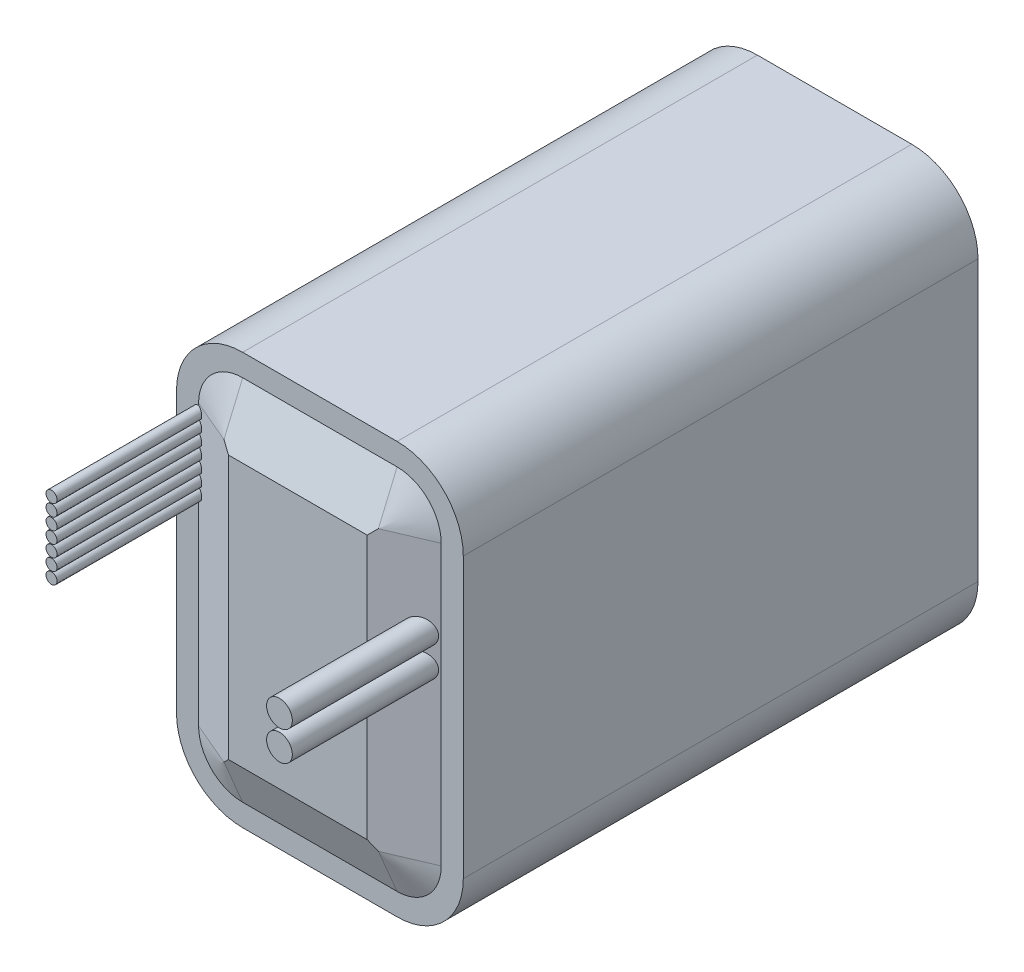
ISO-10303-21;
HEADER;
FILE_DESCRIPTION(('STEP AP214'),'2;1');
FILE_NAME('part.step','',(''),(''),'','','');
FILE_SCHEMA(('AUTOMOTIVE_DESIGN { 1 0 10303 214 1 1 1 1 }'));
ENDSEC;
DATA;
#1=APPLICATION_CONTEXT('core data for automotive mechanical design processes');
#2=APPLICATION_PROTOCOL_DEFINITION('international standard','automotive_design',2000,#1);
#3=PRODUCT_CONTEXT('',#1,'mechanical');
#4=PRODUCT('Part','Part','',(#3));
#5=PRODUCT_RELATED_PRODUCT_CATEGORY('part','',(#4));
#6=PRODUCT_DEFINITION_FORMATION('','',#4);
#7=PRODUCT_DEFINITION_CONTEXT('part definition',#1,'design');
#8=PRODUCT_DEFINITION('design','',#6,#7);
#9=PRODUCT_DEFINITION_SHAPE('','',#8);
#10=(LENGTH_UNIT() NAMED_UNIT(*) SI_UNIT(.MILLI.,.METRE.));
#11=(NAMED_UNIT(*) PLANE_ANGLE_UNIT() SI_UNIT($,.RADIAN.));
#12=(NAMED_UNIT(*) SI_UNIT($,.STERADIAN.) SOLID_ANGLE_UNIT());
#13=UNCERTAINTY_MEASURE_WITH_UNIT(LENGTH_MEASURE(1.E-05),#10,'distance_accuracy_value','');
#14=(GEOMETRIC_REPRESENTATION_CONTEXT(3) GLOBAL_UNCERTAINTY_ASSIGNED_CONTEXT((#13)) GLOBAL_UNIT_ASSIGNED_CONTEXT((#10,
#11,#12)) REPRESENTATION_CONTEXT('',''));
#15=CARTESIAN_POINT('',(0.,0.,0.));
#16=DIRECTION('',(0.,0.,1.));
#17=DIRECTION('',(1.,0.,0.));
#18=AXIS2_PLACEMENT_3D('',#15,#16,#17);
#19=CARTESIAN_POINT('',(10.5,19.,70.));
#20=DIRECTION('',(0.,0.,1.));
#21=DIRECTION('',(1.,0.,0.));
#22=AXIS2_PLACEMENT_3D('',#19,#20,#21);
#23=PLANE('',#22);
#24=CARTESIAN_POINT('',(10.5,19.,70.));
#25=DIRECTION('',(0.,0.,1.));
#26=DIRECTION('',(1.,0.,0.));
#27=AXIS2_PLACEMENT_3D('',#24,#25,#26);
#28=CIRCLE('',#27,9.);
#29=CARTESIAN_POINT('',(19.5,19.,70.));
#30=VERTEX_POINT('',#29);
#31=CARTESIAN_POINT('',(10.5,28.,70.));
#32=VERTEX_POINT('',#31);
#33=EDGE_CURVE('E301',#30,#32,#28,.T.);
#34=ORIENTED_EDGE('',*,*,#33,.T.);
#35=DIRECTION('',(-1.,0.,0.));
#36=VECTOR('',#35,1.);
#37=CARTESIAN_POINT('',(-10.5,28.,70.));
#38=LINE('',#37,#36);
#39=CARTESIAN_POINT('',(-10.5,28.,70.));
#40=VERTEX_POINT('',#39);
#41=EDGE_CURVE('E302',#32,#40,#38,.T.);
#42=ORIENTED_EDGE('',*,*,#41,.T.);
#43=CARTESIAN_POINT('',(-10.5,19.,70.));
#44=DIRECTION('',(0.,0.,1.));
#45=DIRECTION('',(-1.,0.,0.));
#46=AXIS2_PLACEMENT_3D('',#43,#44,#45);
#47=CIRCLE('',#46,9.);
#48=CARTESIAN_POINT('',(-19.5,19.,70.));
#49=VERTEX_POINT('',#48);
#50=EDGE_CURVE('E307',#40,#49,#47,.T.);
#51=ORIENTED_EDGE('',*,*,#50,.T.);
#52=DIRECTION('',(0.,-1.,0.));
#53=VECTOR('',#52,1.);
#54=CARTESIAN_POINT('',(-19.5,-19.,70.));
#55=LINE('',#54,#53);
#56=CARTESIAN_POINT('',(-19.5,-19.,70.));
#57=VERTEX_POINT('',#56);
#58=EDGE_CURVE('E310',#49,#57,#55,.T.);
#59=ORIENTED_EDGE('',*,*,#58,.T.);
#60=CARTESIAN_POINT('',(-10.5,-19.,70.));
#61=DIRECTION('',(0.,0.,1.));
#62=DIRECTION('',(1.,0.,0.));
#63=AXIS2_PLACEMENT_3D('',#60,#61,#62);
#64=CIRCLE('',#63,9.);
#65=CARTESIAN_POINT('',(-10.5,-28.,70.));
#66=VERTEX_POINT('',#65);
#67=EDGE_CURVE('E313',#57,#66,#64,.T.);
#68=ORIENTED_EDGE('',*,*,#67,.T.);
#69=DIRECTION('',(1.,0.,0.));
#70=VECTOR('',#69,1.);
#71=CARTESIAN_POINT('',(-10.5,-28.,70.));
#72=LINE('',#71,#70);
#73=CARTESIAN_POINT('',(10.5,-28.,70.));
#74=VERTEX_POINT('',#73);
#75=EDGE_CURVE('E311',#66,#74,#72,.T.);
#76=ORIENTED_EDGE('',*,*,#75,.T.);
#77=CARTESIAN_POINT('',(10.5,-19.,70.));
#78=DIRECTION('',(0.,0.,1.));
#79=DIRECTION('',(1.,0.,0.));
#80=AXIS2_PLACEMENT_3D('',#77,#78,#79);
#81=CIRCLE('',#80,9.);
#82=CARTESIAN_POINT('',(19.5,-19.,70.));
#83=VERTEX_POINT('',#82);
#84=EDGE_CURVE('E312',#74,#83,#81,.T.);
#85=ORIENTED_EDGE('',*,*,#84,.T.);
#86=DIRECTION('',(0.,1.,0.));
#87=VECTOR('',#86,1.);
#88=CARTESIAN_POINT('',(19.5,-19.,70.));
#89=LINE('',#88,#87);
#90=EDGE_CURVE('E320',#83,#30,#89,.T.);
#91=ORIENTED_EDGE('',*,*,#90,.T.);
#92=EDGE_LOOP('',(#34,#42,#51,#59,#68,#76,#85,#91));
#93=FACE_BOUND('',#92,.T.);
#94=CARTESIAN_POINT('',(-16.5,14.8,70.));
#95=DIRECTION('',(0.,0.,1.));
#96=DIRECTION('',(1.,0.,0.));
#97=AXIS2_PLACEMENT_3D('',#94,#95,#96);
#98=CIRCLE('',#97,0.750000000000002);
#99=CARTESIAN_POINT('',(-16.5,15.55,70.));
#100=VERTEX_POINT('',#99);
#101=CARTESIAN_POINT('',(-16.5,14.05,70.));
#102=VERTEX_POINT('',#101);
#103=EDGE_CURVE('E237',#100,#102,#98,.T.);
#104=ORIENTED_EDGE('',*,*,#103,.F.);
#105=DIRECTION('',(0.,-1.,0.));
#106=VECTOR('',#105,1.);
#107=CARTESIAN_POINT('',(-16.5,19.,70.));
#108=LINE('',#107,#106);
#109=CARTESIAN_POINT('',(-16.5,15.65,70.));
#110=VERTEX_POINT('',#109);
#111=EDGE_CURVE('E232',#110,#100,#108,.T.);
#112=ORIENTED_EDGE('',*,*,#111,.F.);
#113=CARTESIAN_POINT('',(-16.5,16.4,70.));
#114=DIRECTION('',(0.,0.,1.));
#115=DIRECTION('',(1.,0.,0.));
#116=AXIS2_PLACEMENT_3D('',#113,#114,#115);
#117=CIRCLE('',#116,0.750000000000002);
#118=CARTESIAN_POINT('',(-16.5,17.15,70.));
#119=VERTEX_POINT('',#118);
#120=EDGE_CURVE('E228',#119,#110,#117,.T.);
#121=ORIENTED_EDGE('',*,*,#120,.F.);
#122=CARTESIAN_POINT('',(-16.5,17.25,70.));
#123=VERTEX_POINT('',#122);
#124=EDGE_CURVE('E234',#123,#119,#108,.T.);
#125=ORIENTED_EDGE('',*,*,#124,.F.);
#126=CARTESIAN_POINT('',(-16.5,18.,70.));
#127=DIRECTION('',(0.,0.,1.));
#128=DIRECTION('',(1.,0.,0.));
#129=AXIS2_PLACEMENT_3D('',#126,#127,#128);
#130=CIRCLE('',#129,0.750000000000002);
#131=CARTESIAN_POINT('',(-16.5,18.75,70.));
#132=VERTEX_POINT('',#131);
#133=EDGE_CURVE('E754',#132,#123,#130,.T.);
#134=ORIENTED_EDGE('',*,*,#133,.F.);
#135=CARTESIAN_POINT('',(-16.5,19.,70.));
#136=VERTEX_POINT('',#135);
#137=EDGE_CURVE('E236',#136,#132,#108,.T.);
#138=ORIENTED_EDGE('',*,*,#137,.F.);
#139=CARTESIAN_POINT('',(-10.5,19.,70.));
#140=DIRECTION('',(0.,0.,1.));
#141=DIRECTION('',(1.,0.,0.));
#142=AXIS2_PLACEMENT_3D('',#139,#140,#141);
#143=CIRCLE('',#142,6.);
#144=CARTESIAN_POINT('',(-10.5,25.,70.));
#145=VERTEX_POINT('',#144);
#146=EDGE_CURVE('E242',#145,#136,#143,.T.);
#147=ORIENTED_EDGE('',*,*,#146,.F.);
#148=DIRECTION('',(-1.,0.,0.));
#149=VECTOR('',#148,1.);
#150=CARTESIAN_POINT('',(10.5,25.,70.));
#151=LINE('',#150,#149);
#152=CARTESIAN_POINT('',(10.5,25.,70.));
#153=VERTEX_POINT('',#152);
#154=EDGE_CURVE('E374',#153,#145,#151,.T.);
#155=ORIENTED_EDGE('',*,*,#154,.F.);
#156=CARTESIAN_POINT('',(10.5,19.,70.));
#157=DIRECTION('',(0.,0.,1.));
#158=DIRECTION('',(1.,0.,0.));
#159=AXIS2_PLACEMENT_3D('',#156,#157,#158);
#160=CIRCLE('',#159,6.);
#161=CARTESIAN_POINT('',(16.5,19.,70.));
#162=VERTEX_POINT('',#161);
#163=EDGE_CURVE('E373',#162,#153,#160,.T.);
#164=ORIENTED_EDGE('',*,*,#163,.F.);
#165=DIRECTION('',(0.,1.,0.));
#166=VECTOR('',#165,1.);
#167=CARTESIAN_POINT('',(16.5,-19.,70.));
#168=LINE('',#167,#166);
#169=CARTESIAN_POINT('',(16.5,-19.,70.));
#170=VERTEX_POINT('',#169);
#171=EDGE_CURVE('E251',#170,#162,#168,.T.);
#172=ORIENTED_EDGE('',*,*,#171,.F.);
#173=CARTESIAN_POINT('',(10.5,-19.,70.));
#174=DIRECTION('',(0.,0.,1.));
#175=DIRECTION('',(1.,0.,0.));
#176=AXIS2_PLACEMENT_3D('',#173,#174,#175);
#177=CIRCLE('',#176,6.);
#178=CARTESIAN_POINT('',(10.5,-25.,70.));
#179=VERTEX_POINT('',#178);
#180=EDGE_CURVE('E249',#179,#170,#177,.T.);
#181=ORIENTED_EDGE('',*,*,#180,.F.);
#182=DIRECTION('',(1.,0.,0.));
#183=VECTOR('',#182,1.);
#184=CARTESIAN_POINT('',(-10.5,-25.,70.));
#185=LINE('',#184,#183);
#186=CARTESIAN_POINT('',(-10.5,-25.,70.));
#187=VERTEX_POINT('',#186);
#188=EDGE_CURVE('E250',#187,#179,#185,.T.);
#189=ORIENTED_EDGE('',*,*,#188,.F.);
#190=CARTESIAN_POINT('',(-10.5,-19.,70.));
#191=DIRECTION('',(0.,0.,1.));
#192=DIRECTION('',(1.,0.,0.));
#193=AXIS2_PLACEMENT_3D('',#190,#191,#192);
#194=CIRCLE('',#193,6.);
#195=CARTESIAN_POINT('',(-16.5,-19.,70.));
#196=VERTEX_POINT('',#195);
#197=EDGE_CURVE('E245',#196,#187,#194,.T.);
#198=ORIENTED_EDGE('',*,*,#197,.F.);
#199=CARTESIAN_POINT('',(-16.5,7.65,70.));
#200=VERTEX_POINT('',#199);
#201=EDGE_CURVE('E197',#200,#196,#108,.T.);
#202=ORIENTED_EDGE('',*,*,#201,.F.);
#203=CARTESIAN_POINT('',(-16.5,8.4,70.));
#204=DIRECTION('',(0.,0.,1.));
#205=DIRECTION('',(1.,0.,0.));
#206=AXIS2_PLACEMENT_3D('',#203,#204,#205);
#207=CIRCLE('',#206,0.750000000000002);
#208=CARTESIAN_POINT('',(-16.5,9.15,70.));
#209=VERTEX_POINT('',#208);
#210=EDGE_CURVE('E199',#209,#200,#207,.T.);
#211=ORIENTED_EDGE('',*,*,#210,.F.);
#212=CARTESIAN_POINT('',(-16.5,9.25,70.));
#213=VERTEX_POINT('',#212);
#214=EDGE_CURVE('E189',#213,#209,#108,.T.);
#215=ORIENTED_EDGE('',*,*,#214,.F.);
#216=CARTESIAN_POINT('',(-16.5,10.,70.));
#217=DIRECTION('',(0.,0.,1.));
#218=DIRECTION('',(1.,0.,0.));
#219=AXIS2_PLACEMENT_3D('',#216,#217,#218);
#220=CIRCLE('',#219,0.750000000000002);
#221=CARTESIAN_POINT('',(-16.5,10.75,70.));
#222=VERTEX_POINT('',#221);
#223=EDGE_CURVE('E776',#222,#213,#220,.T.);
#224=ORIENTED_EDGE('',*,*,#223,.F.);
#225=CARTESIAN_POINT('',(-16.5,10.85,70.));
#226=VERTEX_POINT('',#225);
#227=EDGE_CURVE('E198',#226,#222,#108,.T.);
#228=ORIENTED_EDGE('',*,*,#227,.F.);
#229=CARTESIAN_POINT('',(-16.5,11.6,70.));
#230=DIRECTION('',(0.,0.,1.));
#231=DIRECTION('',(1.,0.,0.));
#232=AXIS2_PLACEMENT_3D('',#229,#230,#231);
#233=CIRCLE('',#232,0.750000000000002);
#234=CARTESIAN_POINT('',(-16.5,12.35,70.));
#235=VERTEX_POINT('',#234);
#236=EDGE_CURVE('E782',#235,#226,#233,.T.);
#237=ORIENTED_EDGE('',*,*,#236,.F.);
#238=CARTESIAN_POINT('',(-16.5,12.45,70.));
#239=VERTEX_POINT('',#238);
#240=EDGE_CURVE('E239',#239,#235,#108,.T.);
#241=ORIENTED_EDGE('',*,*,#240,.F.);
#242=CARTESIAN_POINT('',(-16.5,13.2,70.));
#243=DIRECTION('',(0.,0.,1.));
#244=DIRECTION('',(1.,0.,0.));
#245=AXIS2_PLACEMENT_3D('',#242,#243,#244);
#246=CIRCLE('',#245,0.750000000000002);
#247=CARTESIAN_POINT('',(-16.5,13.95,70.));
#248=VERTEX_POINT('',#247);
#249=EDGE_CURVE('E745',#248,#239,#246,.T.);
#250=ORIENTED_EDGE('',*,*,#249,.F.);
#251=EDGE_CURVE('E240',#102,#248,#108,.T.);
#252=ORIENTED_EDGE('',*,*,#251,.F.);
#253=EDGE_LOOP('',(#104,#112,#121,#125,#134,#138,#147,#155,#164,#172,#181,#189,#198,#202,#211,
#215,#224,#228,#237,#241,#250,#252));
#254=FACE_BOUND('',#253,.T.);
#255=ADVANCED_FACE('F39',(#93,#254),#23,.T.);
#256=CARTESIAN_POINT('',(10.5,19.,70.));
#257=DIRECTION('',(0.,0.,-1.));
#258=DIRECTION('',(-1.,0.,0.));
#259=AXIS2_PLACEMENT_3D('',#256,#257,#258);
#260=CYLINDRICAL_SURFACE('',#259,9.);
#261=CARTESIAN_POINT('',(10.5,19.,0.));
#262=DIRECTION('',(0.,0.,1.));
#263=DIRECTION('',(1.,0.,0.));
#264=AXIS2_PLACEMENT_3D('',#261,#262,#263);
#265=CIRCLE('',#264,9.);
#266=CARTESIAN_POINT('',(19.5,19.,0.));
#267=VERTEX_POINT('',#266);
#268=CARTESIAN_POINT('',(10.5,28.,0.));
#269=VERTEX_POINT('',#268);
#270=EDGE_CURVE('E268',#267,#269,#265,.T.);
#271=ORIENTED_EDGE('',*,*,#270,.T.);
#272=DIRECTION('',(0.,0.,-1.));
#273=VECTOR('',#272,1.);
#274=CARTESIAN_POINT('',(10.5,28.,70.));
#275=LINE('',#274,#273);
#276=EDGE_CURVE('E354',#32,#269,#275,.T.);
#277=ORIENTED_EDGE('',*,*,#276,.F.);
#278=ORIENTED_EDGE('',*,*,#33,.F.);
#279=DIRECTION('',(0.,0.,-1.));
#280=VECTOR('',#279,1.);
#281=CARTESIAN_POINT('',(19.5,19.,70.));
#282=LINE('',#281,#280);
#283=EDGE_CURVE('E317',#30,#267,#282,.T.);
#284=ORIENTED_EDGE('',*,*,#283,.T.);
#285=EDGE_LOOP('',(#271,#277,#278,#284));
#286=FACE_BOUND('',#285,.T.);
#287=ADVANCED_FACE('F41',(#286),#260,.T.);
#288=CARTESIAN_POINT('',(-10.5,28.,70.));
#289=DIRECTION('',(0.,-1.,0.));
#290=DIRECTION('',(1.,0.,0.));
#291=AXIS2_PLACEMENT_3D('',#288,#289,#290);
#292=PLANE('',#291);
#293=DIRECTION('',(-1.,0.,0.));
#294=VECTOR('',#293,1.);
#295=CARTESIAN_POINT('',(-10.5,28.,0.));
#296=LINE('',#295,#294);
#297=CARTESIAN_POINT('',(-10.5,28.,0.));
#298=VERTEX_POINT('',#297);
#299=EDGE_CURVE('E325',#269,#298,#296,.T.);
#300=ORIENTED_EDGE('',*,*,#299,.T.);
#301=DIRECTION('',(0.,0.,-1.));
#302=VECTOR('',#301,1.);
#303=CARTESIAN_POINT('',(-10.5,28.,70.));
#304=LINE('',#303,#302);
#305=EDGE_CURVE('E355',#40,#298,#304,.T.);
#306=ORIENTED_EDGE('',*,*,#305,.F.);
#307=ORIENTED_EDGE('',*,*,#41,.F.);
#308=ORIENTED_EDGE('',*,*,#276,.T.);
#309=EDGE_LOOP('',(#300,#306,#307,#308));
#310=FACE_BOUND('',#309,.T.);
#311=ADVANCED_FACE('F410',(#310),#292,.F.);
#312=CARTESIAN_POINT('',(-10.5,19.,70.));
#313=DIRECTION('',(0.,0.,-1.));
#314=DIRECTION('',(-1.,0.,0.));
#315=AXIS2_PLACEMENT_3D('',#312,#313,#314);
#316=CYLINDRICAL_SURFACE('',#315,9.);
#317=CARTESIAN_POINT('',(-10.5,19.,0.));
#318=DIRECTION('',(0.,0.,1.));
#319=DIRECTION('',(-1.,0.,0.));
#320=AXIS2_PLACEMENT_3D('',#317,#318,#319);
#321=CIRCLE('',#320,9.);
#322=CARTESIAN_POINT('',(-19.5,19.,0.));
#323=VERTEX_POINT('',#322);
#324=EDGE_CURVE('E322',#298,#323,#321,.T.);
#325=ORIENTED_EDGE('',*,*,#324,.T.);
#326=DIRECTION('',(0.,0.,-1.));
#327=VECTOR('',#326,1.);
#328=CARTESIAN_POINT('',(-19.5,19.,70.));
#329=LINE('',#328,#327);
#330=EDGE_CURVE('E349',#49,#323,#329,.T.);
#331=ORIENTED_EDGE('',*,*,#330,.F.);
#332=ORIENTED_EDGE('',*,*,#50,.F.);
#333=ORIENTED_EDGE('',*,*,#305,.T.);
#334=EDGE_LOOP('',(#325,#331,#332,#333));
#335=FACE_BOUND('',#334,.T.);
#336=ADVANCED_FACE('F434',(#335),#316,.T.);
#337=CARTESIAN_POINT('',(-19.5,-19.,70.));
#338=DIRECTION('',(1.,0.,0.));
#339=DIRECTION('',(0.,1.,0.));
#340=AXIS2_PLACEMENT_3D('',#337,#338,#339);
#341=PLANE('',#340);
#342=DIRECTION('',(0.,-1.,0.));
#343=VECTOR('',#342,1.);
#344=CARTESIAN_POINT('',(-19.5,-19.,0.));
#345=LINE('',#344,#343);
#346=CARTESIAN_POINT('',(-19.5,-19.,0.));
#347=VERTEX_POINT('',#346);
#348=EDGE_CURVE('E326',#323,#347,#345,.T.);
#349=ORIENTED_EDGE('',*,*,#348,.T.);
#350=DIRECTION('',(0.,0.,-1.));
#351=VECTOR('',#350,1.);
#352=CARTESIAN_POINT('',(-19.5,-19.,70.));
#353=LINE('',#352,#351);
#354=EDGE_CURVE('E347',#57,#347,#353,.T.);
#355=ORIENTED_EDGE('',*,*,#354,.F.);
#356=ORIENTED_EDGE('',*,*,#58,.F.);
#357=ORIENTED_EDGE('',*,*,#330,.T.);
#358=EDGE_LOOP('',(#349,#355,#356,#357));
#359=FACE_BOUND('',#358,.T.);
#360=ADVANCED_FACE('F431',(#359),#341,.F.);
#361=CARTESIAN_POINT('',(-10.5,-19.,70.));
#362=DIRECTION('',(0.,0.,-1.));
#363=DIRECTION('',(-1.,0.,0.));
#364=AXIS2_PLACEMENT_3D('',#361,#362,#363);
#365=CYLINDRICAL_SURFACE('',#364,9.);
#366=CARTESIAN_POINT('',(-10.5,-19.,0.));
#367=DIRECTION('',(0.,0.,1.));
#368=DIRECTION('',(1.,0.,0.));
#369=AXIS2_PLACEMENT_3D('',#366,#367,#368);
#370=CIRCLE('',#369,9.);
#371=CARTESIAN_POINT('',(-10.5,-28.,0.));
#372=VERTEX_POINT('',#371);
#373=EDGE_CURVE('E327',#347,#372,#370,.T.);
#374=ORIENTED_EDGE('',*,*,#373,.T.);
#375=DIRECTION('',(0.,0.,-1.));
#376=VECTOR('',#375,1.);
#377=CARTESIAN_POINT('',(-10.5,-28.,70.));
#378=LINE('',#377,#376);
#379=EDGE_CURVE('E344',#66,#372,#378,.T.);
#380=ORIENTED_EDGE('',*,*,#379,.F.);
#381=ORIENTED_EDGE('',*,*,#67,.F.);
#382=ORIENTED_EDGE('',*,*,#354,.T.);
#383=EDGE_LOOP('',(#374,#380,#381,#382));
#384=FACE_BOUND('',#383,.T.);
#385=ADVANCED_FACE('F430',(#384),#365,.T.);
#386=CARTESIAN_POINT('',(-10.5,-28.,70.));
#387=DIRECTION('',(0.,1.,0.));
#388=DIRECTION('',(-1.,0.,0.));
#389=AXIS2_PLACEMENT_3D('',#386,#387,#388);
#390=PLANE('',#389);
#391=DIRECTION('',(1.,0.,0.));
#392=VECTOR('',#391,1.);
#393=CARTESIAN_POINT('',(-10.5,-28.,0.));
#394=LINE('',#393,#392);
#395=CARTESIAN_POINT('',(10.5,-28.,0.));
#396=VERTEX_POINT('',#395);
#397=EDGE_CURVE('E329',#372,#396,#394,.T.);
#398=ORIENTED_EDGE('',*,*,#397,.T.);
#399=DIRECTION('',(0.,0.,-1.));
#400=VECTOR('',#399,1.);
#401=CARTESIAN_POINT('',(10.5,-28.,70.));
#402=LINE('',#401,#400);
#403=EDGE_CURVE('E339',#74,#396,#402,.T.);
#404=ORIENTED_EDGE('',*,*,#403,.F.);
#405=ORIENTED_EDGE('',*,*,#75,.F.);
#406=ORIENTED_EDGE('',*,*,#379,.T.);
#407=EDGE_LOOP('',(#398,#404,#405,#406));
#408=FACE_BOUND('',#407,.T.);
#409=ADVANCED_FACE('F421',(#408),#390,.F.);
#410=CARTESIAN_POINT('',(10.5,-19.,70.));
#411=DIRECTION('',(0.,0.,-1.));
#412=DIRECTION('',(-1.,0.,0.));
#413=AXIS2_PLACEMENT_3D('',#410,#411,#412);
#414=CYLINDRICAL_SURFACE('',#413,9.);
#415=CARTESIAN_POINT('',(10.5,-19.,0.));
#416=DIRECTION('',(0.,0.,1.));
#417=DIRECTION('',(1.,0.,0.));
#418=AXIS2_PLACEMENT_3D('',#415,#416,#417);
#419=CIRCLE('',#418,9.);
#420=CARTESIAN_POINT('',(19.5,-19.,0.));
#421=VERTEX_POINT('',#420);
#422=EDGE_CURVE('E335',#396,#421,#419,.T.);
#423=ORIENTED_EDGE('',*,*,#422,.T.);
#424=DIRECTION('',(0.,0.,-1.));
#425=VECTOR('',#424,1.);
#426=CARTESIAN_POINT('',(19.5,-19.,70.));
#427=LINE('',#426,#425);
#428=EDGE_CURVE('E340',#83,#421,#427,.T.);
#429=ORIENTED_EDGE('',*,*,#428,.F.);
#430=ORIENTED_EDGE('',*,*,#84,.F.);
#431=ORIENTED_EDGE('',*,*,#403,.T.);
#432=EDGE_LOOP('',(#423,#429,#430,#431));
#433=FACE_BOUND('',#432,.T.);
#434=ADVANCED_FACE('F420',(#433),#414,.T.);
#435=CARTESIAN_POINT('',(19.5,-19.,70.));
#436=DIRECTION('',(-1.,0.,0.));
#437=DIRECTION('',(0.,-1.,0.));
#438=AXIS2_PLACEMENT_3D('',#435,#436,#437);
#439=PLANE('',#438);
#440=DIRECTION('',(0.,1.,0.));
#441=VECTOR('',#440,1.);
#442=CARTESIAN_POINT('',(19.5,-19.,0.));
#443=LINE('',#442,#441);
#444=EDGE_CURVE('E304',#421,#267,#443,.T.);
#445=ORIENTED_EDGE('',*,*,#444,.T.);
#446=ORIENTED_EDGE('',*,*,#283,.F.);
#447=ORIENTED_EDGE('',*,*,#90,.F.);
#448=ORIENTED_EDGE('',*,*,#428,.T.);
#449=EDGE_LOOP('',(#445,#446,#447,#448));
#450=FACE_BOUND('',#449,.T.);
#451=ADVANCED_FACE('F414',(#450),#439,.F.);
#452=CARTESIAN_POINT('',(10.5,19.,0.));
#453=DIRECTION('',(0.,0.,1.));
#454=DIRECTION('',(1.,0.,0.));
#455=AXIS2_PLACEMENT_3D('',#452,#453,#454);
#456=PLANE('',#455);
#457=ORIENTED_EDGE('',*,*,#270,.F.);
#458=ORIENTED_EDGE('',*,*,#444,.F.);
#459=ORIENTED_EDGE('',*,*,#422,.F.);
#460=ORIENTED_EDGE('',*,*,#397,.F.);
#461=ORIENTED_EDGE('',*,*,#373,.F.);
#462=ORIENTED_EDGE('',*,*,#348,.F.);
#463=ORIENTED_EDGE('',*,*,#324,.F.);
#464=ORIENTED_EDGE('',*,*,#299,.F.);
#465=EDGE_LOOP('',(#457,#458,#459,#460,#461,#462,#463,#464));
#466=FACE_BOUND('',#465,.T.);
#467=ADVANCED_FACE('F415',(#466),#456,.F.);
#468=CARTESIAN_POINT('',(10.5,19.,70.));
#469=DIRECTION('',(0.,0.,-1.));
#470=DIRECTION('',(1.,0.,0.));
#471=AXIS2_PLACEMENT_3D('',#468,#469,#470);
#472=CONICAL_SURFACE('',#471,6.,1.1693705988362);
#473=DIRECTION('',(0.,0.920504853452441,-0.390731128489273));
#474=VECTOR('',#473,1.);
#475=CARTESIAN_POINT('',(10.5,25.,70.));
#476=LINE('',#475,#474);
#477=CARTESIAN_POINT('',(10.5,19.,72.5468488972576));
#478=VERTEX_POINT('',#477);
#479=EDGE_CURVE('E260',#478,#153,#476,.T.);
#480=ORIENTED_EDGE('',*,*,#479,.F.);
#481=DIRECTION('',(0.920504853452441,0.,-0.390731128489273));
#482=VECTOR('',#481,1.);
#483=CARTESIAN_POINT('',(16.5,19.,70.));
#484=LINE('',#483,#482);
#485=EDGE_CURVE('E265',#478,#162,#484,.T.);
#486=ORIENTED_EDGE('',*,*,#485,.T.);
#487=ORIENTED_EDGE('',*,*,#163,.T.);
#488=EDGE_LOOP('',(#480,#486,#487));
#489=FACE_BOUND('',#488,.T.);
#490=ADVANCED_FACE('F379',(#489),#472,.T.);
#491=CARTESIAN_POINT('',(10.5,25.,70.));
#492=DIRECTION('',(0.,0.390731128489273,0.920504853452441));
#493=DIRECTION('',(0.,-0.920504853452441,0.390731128489273));
#494=AXIS2_PLACEMENT_3D('',#491,#492,#493);
#495=PLANE('',#494);
#496=ORIENTED_EDGE('',*,*,#154,.T.);
#497=DIRECTION('',(0.,0.920504853452441,-0.390731128489273));
#498=VECTOR('',#497,1.);
#499=CARTESIAN_POINT('',(-10.5,25.,70.));
#500=LINE('',#499,#498);
#501=CARTESIAN_POINT('',(-10.5,19.,72.5468488972576));
#502=VERTEX_POINT('',#501);
#503=EDGE_CURVE('E261',#502,#145,#500,.T.);
#504=ORIENTED_EDGE('',*,*,#503,.F.);
#505=DIRECTION('',(-0.677257677459682,0.677257677459682,-0.287478828166241));
#506=VECTOR('',#505,1.);
#507=CARTESIAN_POINT('',(-13.7479322299315,22.2479322299315,71.1681834608962));
#508=LINE('',#507,#506);
#509=CARTESIAN_POINT('',(-9.43244290252871,17.9324429025287,73.));
#510=VERTEX_POINT('',#509);
#511=EDGE_CURVE('E284',#510,#502,#508,.T.);
#512=ORIENTED_EDGE('',*,*,#511,.F.);
#513=DIRECTION('',(1.,0.,0.));
#514=VECTOR('',#513,1.);
#515=CARTESIAN_POINT('',(10.5,17.9324429025287,73.));
#516=LINE('',#515,#514);
#517=CARTESIAN_POINT('',(9.43244290252872,17.9324429025287,73.));
#518=VERTEX_POINT('',#517);
#519=EDGE_CURVE('E258',#518,#510,#516,.F.);
#520=ORIENTED_EDGE('',*,*,#519,.F.);
#521=DIRECTION('',(0.677257677459682,0.677257677459682,-0.287478828166241));
#522=VECTOR('',#521,1.);
#523=CARTESIAN_POINT('',(13.7479322299315,22.2479322299315,71.1681834608962));
#524=LINE('',#523,#522);
#525=EDGE_CURVE('E257',#518,#478,#524,.T.);
#526=ORIENTED_EDGE('',*,*,#525,.T.);
#527=ORIENTED_EDGE('',*,*,#479,.T.);
#528=EDGE_LOOP('',(#496,#504,#512,#520,#526,#527));
#529=FACE_BOUND('',#528,.T.);
#530=ADVANCED_FACE('F385',(#529),#495,.T.);
#531=CARTESIAN_POINT('',(-10.5,19.,70.));
#532=DIRECTION('',(0.,0.,-1.));
#533=DIRECTION('',(1.,0.,0.));
#534=AXIS2_PLACEMENT_3D('',#531,#532,#533);
#535=CONICAL_SURFACE('',#534,6.,1.1693705988362);
#536=DIRECTION('',(-0.920504853452441,0.,-0.390731128489273));
#537=VECTOR('',#536,1.);
#538=CARTESIAN_POINT('',(-16.5,19.,70.));
#539=LINE('',#538,#537);
#540=EDGE_CURVE('E283',#502,#136,#539,.T.);
#541=ORIENTED_EDGE('',*,*,#540,.F.);
#542=ORIENTED_EDGE('',*,*,#503,.T.);
#543=ORIENTED_EDGE('',*,*,#146,.T.);
#544=EDGE_LOOP('',(#541,#542,#543));
#545=FACE_BOUND('',#544,.T.);
#546=ADVANCED_FACE('F516',(#545),#535,.T.);
#547=CARTESIAN_POINT('',(-16.5,19.,70.));
#548=DIRECTION('',(-0.390731128489273,0.,0.920504853452441));
#549=DIRECTION('',(0.920504853452441,0.,0.390731128489273));
#550=AXIS2_PLACEMENT_3D('',#547,#548,#549);
#551=PLANE('',#550);
#552=CARTESIAN_POINT('',(-16.5,14.8,70.));
#553=DIRECTION('',(-0.390731128489273,0.,0.920504853452441));
#554=DIRECTION('',(-0.920504853452441,0.,-0.390731128489273));
#555=AXIS2_PLACEMENT_3D('',#552,#553,#554);
#556=ELLIPSE('',#555,0.814770283053974,0.750000000000002);
#557=EDGE_CURVE('E11',#102,#100,#556,.T.);
#558=ORIENTED_EDGE('',*,*,#557,.F.);
#559=ORIENTED_EDGE('',*,*,#251,.T.);
#560=CARTESIAN_POINT('',(-16.5,13.2,70.));
#561=DIRECTION('',(-0.390731128489273,0.,0.920504853452441));
#562=DIRECTION('',(-0.920504853452441,0.,-0.390731128489273));
#563=AXIS2_PLACEMENT_3D('',#560,#561,#562);
#564=ELLIPSE('',#563,0.814770283053974,0.750000000000002);
#565=EDGE_CURVE('E218',#239,#248,#564,.T.);
#566=ORIENTED_EDGE('',*,*,#565,.F.);
#567=ORIENTED_EDGE('',*,*,#240,.T.);
#568=CARTESIAN_POINT('',(-16.5,11.6,70.));
#569=DIRECTION('',(-0.390731128489273,0.,0.920504853452441));
#570=DIRECTION('',(-0.920504853452441,0.,-0.390731128489273));
#571=AXIS2_PLACEMENT_3D('',#568,#569,#570);
#572=ELLIPSE('',#571,0.814770283053974,0.750000000000002);
#573=EDGE_CURVE('E209',#226,#235,#572,.T.);
#574=ORIENTED_EDGE('',*,*,#573,.F.);
#575=ORIENTED_EDGE('',*,*,#227,.T.);
#576=CARTESIAN_POINT('',(-16.5,10.,70.));
#577=DIRECTION('',(-0.390731128489273,0.,0.920504853452441));
#578=DIRECTION('',(-0.920504853452441,0.,-0.390731128489273));
#579=AXIS2_PLACEMENT_3D('',#576,#577,#578);
#580=ELLIPSE('',#579,0.814770283053974,0.750000000000002);
#581=EDGE_CURVE('E58',#213,#222,#580,.T.);
#582=ORIENTED_EDGE('',*,*,#581,.F.);
#583=ORIENTED_EDGE('',*,*,#214,.T.);
#584=CARTESIAN_POINT('',(-16.5,8.4,70.));
#585=DIRECTION('',(-0.390731128489273,0.,0.920504853452441));
#586=DIRECTION('',(-0.920504853452441,0.,-0.390731128489273));
#587=AXIS2_PLACEMENT_3D('',#584,#585,#586);
#588=ELLIPSE('',#587,0.814770283053974,0.750000000000002);
#589=EDGE_CURVE('E53',#200,#209,#588,.T.);
#590=ORIENTED_EDGE('',*,*,#589,.F.);
#591=ORIENTED_EDGE('',*,*,#201,.T.);
#592=DIRECTION('',(-0.920504853452441,0.,-0.390731128489273));
#593=VECTOR('',#592,1.);
#594=CARTESIAN_POINT('',(-16.5,-19.,70.));
#595=LINE('',#594,#593);
#596=CARTESIAN_POINT('',(-10.5,-19.,72.5468488972576));
#597=VERTEX_POINT('',#596);
#598=EDGE_CURVE('E276',#597,#196,#595,.T.);
#599=ORIENTED_EDGE('',*,*,#598,.F.);
#600=DIRECTION('',(-0.677257677459682,-0.677257677459682,-0.287478828166241));
#601=VECTOR('',#600,1.);
#602=CARTESIAN_POINT('',(-13.7479322299315,-22.2479322299315,71.1681834608962));
#603=LINE('',#602,#601);
#604=CARTESIAN_POINT('',(-9.43244290252871,-17.9324429025287,73.));
#605=VERTEX_POINT('',#604);
#606=EDGE_CURVE('E280',#605,#597,#603,.T.);
#607=ORIENTED_EDGE('',*,*,#606,.F.);
#608=DIRECTION('',(0.,1.,0.));
#609=VECTOR('',#608,1.);
#610=CARTESIAN_POINT('',(-9.43244290252871,19.,73.));
#611=LINE('',#610,#609);
#612=EDGE_CURVE('E296',#510,#605,#611,.F.);
#613=ORIENTED_EDGE('',*,*,#612,.F.);
#614=ORIENTED_EDGE('',*,*,#511,.T.);
#615=ORIENTED_EDGE('',*,*,#540,.T.);
#616=ORIENTED_EDGE('',*,*,#137,.T.);
#617=CARTESIAN_POINT('',(-16.5,18.,70.));
#618=DIRECTION('',(-0.390731128489273,0.,0.920504853452441));
#619=DIRECTION('',(-0.920504853452441,0.,-0.390731128489273));
#620=AXIS2_PLACEMENT_3D('',#617,#618,#619);
#621=ELLIPSE('',#620,0.814770283053974,0.750000000000002);
#622=EDGE_CURVE('E225',#123,#132,#621,.T.);
#623=ORIENTED_EDGE('',*,*,#622,.F.);
#624=ORIENTED_EDGE('',*,*,#124,.T.);
#625=CARTESIAN_POINT('',(-16.5,16.4,70.));
#626=DIRECTION('',(-0.390731128489273,0.,0.920504853452441));
#627=DIRECTION('',(-0.920504853452441,0.,-0.390731128489273));
#628=AXIS2_PLACEMENT_3D('',#625,#626,#627);
#629=ELLIPSE('',#628,0.814770283053974,0.750000000000002);
#630=EDGE_CURVE('E50',#110,#119,#629,.T.);
#631=ORIENTED_EDGE('',*,*,#630,.F.);
#632=ORIENTED_EDGE('',*,*,#111,.T.);
#633=EDGE_LOOP('',(#558,#559,#566,#567,#574,#575,#582,#583,#590,#591,#599,#607,#613,#614,#615,
#616,#623,#624,#631,#632));
#634=FACE_BOUND('',#633,.T.);
#635=ADVANCED_FACE('F195',(#634),#551,.T.);
#636=CARTESIAN_POINT('',(-10.5,-19.,70.));
#637=DIRECTION('',(0.,0.,-1.));
#638=DIRECTION('',(1.,0.,0.));
#639=AXIS2_PLACEMENT_3D('',#636,#637,#638);
#640=CONICAL_SURFACE('',#639,6.,1.1693705988362);
#641=DIRECTION('',(0.,-0.920504853452441,-0.390731128489273));
#642=VECTOR('',#641,1.);
#643=CARTESIAN_POINT('',(-10.5,-25.,70.));
#644=LINE('',#643,#642);
#645=EDGE_CURVE('E277',#597,#187,#644,.T.);
#646=ORIENTED_EDGE('',*,*,#645,.F.);
#647=ORIENTED_EDGE('',*,*,#598,.T.);
#648=ORIENTED_EDGE('',*,*,#197,.T.);
#649=EDGE_LOOP('',(#646,#647,#648));
#650=FACE_BOUND('',#649,.T.);
#651=ADVANCED_FACE('F399',(#650),#640,.T.);
#652=CARTESIAN_POINT('',(-10.5,-25.,70.));
#653=DIRECTION('',(0.,-0.390731128489273,0.920504853452441));
#654=DIRECTION('',(0.,0.920504853452441,0.390731128489273));
#655=AXIS2_PLACEMENT_3D('',#652,#653,#654);
#656=PLANE('',#655);
#657=ORIENTED_EDGE('',*,*,#188,.T.);
#658=DIRECTION('',(0.,-0.920504853452441,-0.390731128489273));
#659=VECTOR('',#658,1.);
#660=CARTESIAN_POINT('',(10.5,-25.,70.));
#661=LINE('',#660,#659);
#662=CARTESIAN_POINT('',(10.5,-19.,72.5468488972576));
#663=VERTEX_POINT('',#662);
#664=EDGE_CURVE('E271',#663,#179,#661,.T.);
#665=ORIENTED_EDGE('',*,*,#664,.F.);
#666=DIRECTION('',(0.677257677459682,-0.677257677459682,-0.287478828166241));
#667=VECTOR('',#666,1.);
#668=CARTESIAN_POINT('',(13.7479322299315,-22.2479322299315,71.1681834608962));
#669=LINE('',#668,#667);
#670=CARTESIAN_POINT('',(9.43244290252872,-17.9324429025287,73.));
#671=VERTEX_POINT('',#670);
#672=EDGE_CURVE('E267',#671,#663,#669,.T.);
#673=ORIENTED_EDGE('',*,*,#672,.F.);
#674=DIRECTION('',(-1.,0.,0.));
#675=VECTOR('',#674,1.);
#676=CARTESIAN_POINT('',(-10.5,-17.9324429025287,73.));
#677=LINE('',#676,#675);
#678=EDGE_CURVE('E291',#605,#671,#677,.F.);
#679=ORIENTED_EDGE('',*,*,#678,.F.);
#680=ORIENTED_EDGE('',*,*,#606,.T.);
#681=ORIENTED_EDGE('',*,*,#645,.T.);
#682=EDGE_LOOP('',(#657,#665,#673,#679,#680,#681));
#683=FACE_BOUND('',#682,.T.);
#684=ADVANCED_FACE('F388',(#683),#656,.T.);
#685=CARTESIAN_POINT('',(10.5,-19.,70.));
#686=DIRECTION('',(0.,0.,-1.));
#687=DIRECTION('',(1.,0.,0.));
#688=AXIS2_PLACEMENT_3D('',#685,#686,#687);
#689=CONICAL_SURFACE('',#688,6.,1.1693705988362);
#690=DIRECTION('',(0.920504853452441,0.,-0.390731128489273));
#691=VECTOR('',#690,1.);
#692=CARTESIAN_POINT('',(16.5,-19.,70.));
#693=LINE('',#692,#691);
#694=EDGE_CURVE('E264',#663,#170,#693,.T.);
#695=ORIENTED_EDGE('',*,*,#694,.F.);
#696=ORIENTED_EDGE('',*,*,#664,.T.);
#697=ORIENTED_EDGE('',*,*,#180,.T.);
#698=EDGE_LOOP('',(#695,#696,#697));
#699=FACE_BOUND('',#698,.T.);
#700=ADVANCED_FACE('F368',(#699),#689,.T.);
#701=CARTESIAN_POINT('',(16.5,-19.,70.));
#702=DIRECTION('',(0.390731128489273,0.,0.920504853452441));
#703=DIRECTION('',(-0.920504853452441,0.,0.390731128489273));
#704=AXIS2_PLACEMENT_3D('',#701,#702,#703);
#705=PLANE('',#704);
#706=CARTESIAN_POINT('',(14.5,4.,70.8489496324192));
#707=DIRECTION('',(0.390731128489273,0.,0.920504853452441));
#708=DIRECTION('',(0.920504853452441,0.,-0.390731128489273));
#709=AXIS2_PLACEMENT_3D('',#706,#707,#708);
#710=ELLIPSE('',#709,1.90113066045927,1.75);
#711=CARTESIAN_POINT('',(16.25,4.,70.1061187040524));
#712=VERTEX_POINT('',#711);
#713=EDGE_CURVE('E208',#712,#712,#710,.T.);
#714=ORIENTED_EDGE('',*,*,#713,.F.);
#715=EDGE_LOOP('',(#714));
#716=FACE_BOUND('',#715,.T.);
#717=CARTESIAN_POINT('',(14.5,8.,70.8489496324192));
#718=DIRECTION('',(0.390731128489273,0.,0.920504853452441));
#719=DIRECTION('',(0.920504853452441,0.,-0.390731128489273));
#720=AXIS2_PLACEMENT_3D('',#717,#718,#719);
#721=ELLIPSE('',#720,1.90113066045927,1.75);
#722=CARTESIAN_POINT('',(16.25,8.,70.1061187040524));
#723=VERTEX_POINT('',#722);
#724=EDGE_CURVE('E213',#723,#723,#721,.T.);
#725=ORIENTED_EDGE('',*,*,#724,.F.);
#726=EDGE_LOOP('',(#725));
#727=FACE_BOUND('',#726,.T.);
#728=ORIENTED_EDGE('',*,*,#171,.T.);
#729=ORIENTED_EDGE('',*,*,#485,.F.);
#730=ORIENTED_EDGE('',*,*,#525,.F.);
#731=DIRECTION('',(0.,-1.,0.));
#732=VECTOR('',#731,1.);
#733=CARTESIAN_POINT('',(9.43244290252872,-19.,73.));
#734=LINE('',#733,#732);
#735=EDGE_CURVE('E266',#671,#518,#734,.F.);
#736=ORIENTED_EDGE('',*,*,#735,.F.);
#737=ORIENTED_EDGE('',*,*,#672,.T.);
#738=ORIENTED_EDGE('',*,*,#694,.T.);
#739=EDGE_LOOP('',(#728,#729,#730,#736,#737,#738));
#740=FACE_BOUND('',#739,.T.);
#741=ADVANCED_FACE('F362',(#716,#727,#740),#705,.T.);
#742=CARTESIAN_POINT('',(10.5,19.,73.));
#743=DIRECTION('',(0.,0.,1.));
#744=DIRECTION('',(1.,0.,0.));
#745=AXIS2_PLACEMENT_3D('',#742,#743,#744);
#746=PLANE('',#745);
#747=ORIENTED_EDGE('',*,*,#735,.T.);
#748=ORIENTED_EDGE('',*,*,#519,.T.);
#749=ORIENTED_EDGE('',*,*,#612,.T.);
#750=ORIENTED_EDGE('',*,*,#678,.T.);
#751=EDGE_LOOP('',(#747,#748,#749,#750));
#752=FACE_BOUND('',#751,.T.);
#753=ADVANCED_FACE('F364',(#752),#746,.T.);
#754=CARTESIAN_POINT('',(14.5,8.,90.));
#755=DIRECTION('',(0.,0.,-1.));
#756=DIRECTION('',(-1.,0.,0.));
#757=AXIS2_PLACEMENT_3D('',#754,#755,#756);
#758=CYLINDRICAL_SURFACE('',#757,1.75);
#759=CARTESIAN_POINT('',(14.5,8.,90.));
#760=DIRECTION('',(0.,0.,1.));
#761=DIRECTION('',(1.,0.,0.));
#762=AXIS2_PLACEMENT_3D('',#759,#760,#761);
#763=CIRCLE('',#762,1.75);
#764=CARTESIAN_POINT('',(16.25,8.,90.));
#765=VERTEX_POINT('',#764);
#766=EDGE_CURVE('E378',#765,#765,#763,.T.);
#767=ORIENTED_EDGE('',*,*,#766,.F.);
#768=EDGE_LOOP('',(#767));
#769=FACE_BOUND('',#768,.T.);
#770=ORIENTED_EDGE('',*,*,#724,.T.);
#771=EDGE_LOOP('',(#770));
#772=FACE_BOUND('',#771,.T.);
#773=ADVANCED_FACE('F359',(#769,#772),#758,.T.);
#774=CARTESIAN_POINT('',(14.5,8.,90.));
#775=DIRECTION('',(0.,0.,1.));
#776=DIRECTION('',(1.,0.,0.));
#777=AXIS2_PLACEMENT_3D('',#774,#775,#776);
#778=PLANE('',#777);
#779=ORIENTED_EDGE('',*,*,#766,.T.);
#780=EDGE_LOOP('',(#779));
#781=FACE_BOUND('',#780,.T.);
#782=ADVANCED_FACE('F566',(#781),#778,.T.);
#783=CARTESIAN_POINT('',(14.5,4.,90.));
#784=DIRECTION('',(0.,0.,-1.));
#785=DIRECTION('',(-1.,0.,0.));
#786=AXIS2_PLACEMENT_3D('',#783,#784,#785);
#787=CYLINDRICAL_SURFACE('',#786,1.75);
#788=CARTESIAN_POINT('',(14.5,4.,90.));
#789=DIRECTION('',(0.,0.,1.));
#790=DIRECTION('',(1.,0.,0.));
#791=AXIS2_PLACEMENT_3D('',#788,#789,#790);
#792=CIRCLE('',#791,1.75);
#793=CARTESIAN_POINT('',(16.25,4.,90.));
#794=VERTEX_POINT('',#793);
#795=EDGE_CURVE('E753',#794,#794,#792,.T.);
#796=ORIENTED_EDGE('',*,*,#795,.F.);
#797=EDGE_LOOP('',(#796));
#798=FACE_BOUND('',#797,.T.);
#799=ORIENTED_EDGE('',*,*,#713,.T.);
#800=EDGE_LOOP('',(#799));
#801=FACE_BOUND('',#800,.T.);
#802=ADVANCED_FACE('F578',(#798,#801),#787,.T.);
#803=CARTESIAN_POINT('',(14.5,4.,90.));
#804=DIRECTION('',(0.,0.,1.));
#805=DIRECTION('',(1.,0.,0.));
#806=AXIS2_PLACEMENT_3D('',#803,#804,#805);
#807=PLANE('',#806);
#808=ORIENTED_EDGE('',*,*,#795,.T.);
#809=EDGE_LOOP('',(#808));
#810=FACE_BOUND('',#809,.T.);
#811=ADVANCED_FACE('F586',(#810),#807,.T.);
#812=CARTESIAN_POINT('',(-16.5,8.4,90.));
#813=DIRECTION('',(0.,0.,-1.));
#814=DIRECTION('',(-1.,0.,0.));
#815=AXIS2_PLACEMENT_3D('',#812,#813,#814);
#816=CYLINDRICAL_SURFACE('',#815,0.750000000000002);
#817=CARTESIAN_POINT('',(-16.5,8.4,90.));
#818=DIRECTION('',(0.,0.,1.));
#819=DIRECTION('',(1.,0.,0.));
#820=AXIS2_PLACEMENT_3D('',#817,#818,#819);
#821=CIRCLE('',#820,0.750000000000002);
#822=CARTESIAN_POINT('',(-15.75,8.4,90.));
#823=VERTEX_POINT('',#822);
#824=EDGE_CURVE('E202',#823,#823,#821,.T.);
#825=ORIENTED_EDGE('',*,*,#824,.F.);
#826=EDGE_LOOP('',(#825));
#827=FACE_BOUND('',#826,.T.);
#828=ORIENTED_EDGE('',*,*,#210,.T.);
#829=ORIENTED_EDGE('',*,*,#589,.T.);
#830=EDGE_LOOP('',(#828,#829));
#831=FACE_BOUND('',#830,.T.);
#832=ADVANCED_FACE('F210',(#827,#831),#816,.T.);
#833=CARTESIAN_POINT('',(-16.5,8.4,90.));
#834=DIRECTION('',(0.,0.,1.));
#835=DIRECTION('',(1.,0.,0.));
#836=AXIS2_PLACEMENT_3D('',#833,#834,#835);
#837=PLANE('',#836);
#838=ORIENTED_EDGE('',*,*,#824,.T.);
#839=EDGE_LOOP('',(#838));
#840=FACE_BOUND('',#839,.T.);
#841=ADVANCED_FACE('F610',(#840),#837,.T.);
#842=CARTESIAN_POINT('',(-16.5,10.,90.));
#843=DIRECTION('',(0.,0.,-1.));
#844=DIRECTION('',(-1.,0.,0.));
#845=AXIS2_PLACEMENT_3D('',#842,#843,#844);
#846=CYLINDRICAL_SURFACE('',#845,0.750000000000002);
#847=CARTESIAN_POINT('',(-16.5,10.,90.));
#848=DIRECTION('',(0.,0.,1.));
#849=DIRECTION('',(1.,0.,0.));
#850=AXIS2_PLACEMENT_3D('',#847,#848,#849);
#851=CIRCLE('',#850,0.750000000000002);
#852=CARTESIAN_POINT('',(-15.75,10.,90.));
#853=VERTEX_POINT('',#852);
#854=EDGE_CURVE('E204',#853,#853,#851,.T.);
#855=ORIENTED_EDGE('',*,*,#854,.F.);
#856=EDGE_LOOP('',(#855));
#857=FACE_BOUND('',#856,.T.);
#858=ORIENTED_EDGE('',*,*,#223,.T.);
#859=ORIENTED_EDGE('',*,*,#581,.T.);
#860=EDGE_LOOP('',(#858,#859));
#861=FACE_BOUND('',#860,.T.);
#862=ADVANCED_FACE('F620',(#857,#861),#846,.T.);
#863=CARTESIAN_POINT('',(-16.5,10.,90.));
#864=DIRECTION('',(0.,0.,1.));
#865=DIRECTION('',(1.,0.,0.));
#866=AXIS2_PLACEMENT_3D('',#863,#864,#865);
#867=PLANE('',#866);
#868=ORIENTED_EDGE('',*,*,#854,.T.);
#869=EDGE_LOOP('',(#868));
#870=FACE_BOUND('',#869,.T.);
#871=ADVANCED_FACE('F630',(#870),#867,.T.);
#872=CARTESIAN_POINT('',(-16.5,11.6,90.));
#873=DIRECTION('',(0.,0.,-1.));
#874=DIRECTION('',(-1.,0.,0.));
#875=AXIS2_PLACEMENT_3D('',#872,#873,#874);
#876=CYLINDRICAL_SURFACE('',#875,0.750000000000002);
#877=CARTESIAN_POINT('',(-16.5,11.6,90.));
#878=DIRECTION('',(0.,0.,1.));
#879=DIRECTION('',(1.,0.,0.));
#880=AXIS2_PLACEMENT_3D('',#877,#878,#879);
#881=CIRCLE('',#880,0.750000000000002);
#882=CARTESIAN_POINT('',(-15.75,11.6,90.));
#883=VERTEX_POINT('',#882);
#884=EDGE_CURVE('E777',#883,#883,#881,.T.);
#885=ORIENTED_EDGE('',*,*,#884,.F.);
#886=EDGE_LOOP('',(#885));
#887=FACE_BOUND('',#886,.T.);
#888=ORIENTED_EDGE('',*,*,#236,.T.);
#889=ORIENTED_EDGE('',*,*,#573,.T.);
#890=EDGE_LOOP('',(#888,#889));
#891=FACE_BOUND('',#890,.T.);
#892=ADVANCED_FACE('F637',(#887,#891),#876,.T.);
#893=CARTESIAN_POINT('',(-16.5,11.6,90.));
#894=DIRECTION('',(0.,0.,1.));
#895=DIRECTION('',(1.,0.,0.));
#896=AXIS2_PLACEMENT_3D('',#893,#894,#895);
#897=PLANE('',#896);
#898=ORIENTED_EDGE('',*,*,#884,.T.);
#899=EDGE_LOOP('',(#898));
#900=FACE_BOUND('',#899,.T.);
#901=ADVANCED_FACE('F650',(#900),#897,.T.);
#902=CARTESIAN_POINT('',(-16.5,13.2,90.));
#903=DIRECTION('',(0.,0.,-1.));
#904=DIRECTION('',(-1.,0.,0.));
#905=AXIS2_PLACEMENT_3D('',#902,#903,#904);
#906=CYLINDRICAL_SURFACE('',#905,0.750000000000002);
#907=CARTESIAN_POINT('',(-16.5,13.2,90.));
#908=DIRECTION('',(0.,0.,1.));
#909=DIRECTION('',(1.,0.,0.));
#910=AXIS2_PLACEMENT_3D('',#907,#908,#909);
#911=CIRCLE('',#910,0.750000000000002);
#912=CARTESIAN_POINT('',(-15.75,13.2,90.));
#913=VERTEX_POINT('',#912);
#914=EDGE_CURVE('E747',#913,#913,#911,.T.);
#915=ORIENTED_EDGE('',*,*,#914,.F.);
#916=EDGE_LOOP('',(#915));
#917=FACE_BOUND('',#916,.T.);
#918=ORIENTED_EDGE('',*,*,#249,.T.);
#919=ORIENTED_EDGE('',*,*,#565,.T.);
#920=EDGE_LOOP('',(#918,#919));
#921=FACE_BOUND('',#920,.T.);
#922=ADVANCED_FACE('F660',(#917,#921),#906,.T.);
#923=CARTESIAN_POINT('',(-16.5,13.2,90.));
#924=DIRECTION('',(0.,0.,1.));
#925=DIRECTION('',(1.,0.,0.));
#926=AXIS2_PLACEMENT_3D('',#923,#924,#925);
#927=PLANE('',#926);
#928=ORIENTED_EDGE('',*,*,#914,.T.);
#929=EDGE_LOOP('',(#928));
#930=FACE_BOUND('',#929,.T.);
#931=ADVANCED_FACE('F670',(#930),#927,.T.);
#932=CARTESIAN_POINT('',(-16.5,18.,90.));
#933=DIRECTION('',(0.,0.,-1.));
#934=DIRECTION('',(-1.,0.,0.));
#935=AXIS2_PLACEMENT_3D('',#932,#933,#934);
#936=CYLINDRICAL_SURFACE('',#935,0.750000000000002);
#937=CARTESIAN_POINT('',(-16.5,18.,90.));
#938=DIRECTION('',(0.,0.,1.));
#939=DIRECTION('',(1.,0.,0.));
#940=AXIS2_PLACEMENT_3D('',#937,#938,#939);
#941=CIRCLE('',#940,0.750000000000002);
#942=CARTESIAN_POINT('',(-15.75,18.,90.));
#943=VERTEX_POINT('',#942);
#944=EDGE_CURVE('E760',#943,#943,#941,.T.);
#945=ORIENTED_EDGE('',*,*,#944,.F.);
#946=EDGE_LOOP('',(#945));
#947=FACE_BOUND('',#946,.T.);
#948=ORIENTED_EDGE('',*,*,#133,.T.);
#949=ORIENTED_EDGE('',*,*,#622,.T.);
#950=EDGE_LOOP('',(#948,#949));
#951=FACE_BOUND('',#950,.T.);
#952=ADVANCED_FACE('F680',(#947,#951),#936,.T.);
#953=CARTESIAN_POINT('',(-16.5,18.,90.));
#954=DIRECTION('',(0.,0.,1.));
#955=DIRECTION('',(1.,0.,0.));
#956=AXIS2_PLACEMENT_3D('',#953,#954,#955);
#957=PLANE('',#956);
#958=ORIENTED_EDGE('',*,*,#944,.T.);
#959=EDGE_LOOP('',(#958));
#960=FACE_BOUND('',#959,.T.);
#961=ADVANCED_FACE('F690',(#960),#957,.T.);
#962=CARTESIAN_POINT('',(-16.5,16.4,90.));
#963=DIRECTION('',(0.,0.,-1.));
#964=DIRECTION('',(-1.,0.,0.));
#965=AXIS2_PLACEMENT_3D('',#962,#963,#964);
#966=CYLINDRICAL_SURFACE('',#965,0.750000000000002);
#967=CARTESIAN_POINT('',(-16.5,16.4,90.));
#968=DIRECTION('',(0.,0.,1.));
#969=DIRECTION('',(1.,0.,0.));
#970=AXIS2_PLACEMENT_3D('',#967,#968,#969);
#971=CIRCLE('',#970,0.750000000000002);
#972=CARTESIAN_POINT('',(-15.75,16.4,90.));
#973=VERTEX_POINT('',#972);
#974=EDGE_CURVE('E742',#973,#973,#971,.T.);
#975=ORIENTED_EDGE('',*,*,#974,.F.);
#976=EDGE_LOOP('',(#975));
#977=FACE_BOUND('',#976,.T.);
#978=ORIENTED_EDGE('',*,*,#120,.T.);
#979=ORIENTED_EDGE('',*,*,#630,.T.);
#980=EDGE_LOOP('',(#978,#979));
#981=FACE_BOUND('',#980,.T.);
#982=ADVANCED_FACE('F230',(#977,#981),#966,.T.);
#983=CARTESIAN_POINT('',(-16.5,16.4,90.));
#984=DIRECTION('',(0.,0.,1.));
#985=DIRECTION('',(1.,0.,0.));
#986=AXIS2_PLACEMENT_3D('',#983,#984,#985);
#987=PLANE('',#986);
#988=ORIENTED_EDGE('',*,*,#974,.T.);
#989=EDGE_LOOP('',(#988));
#990=FACE_BOUND('',#989,.T.);
#991=ADVANCED_FACE('F706',(#990),#987,.T.);
#992=CARTESIAN_POINT('',(-16.5,14.8,90.));
#993=DIRECTION('',(0.,0.,-1.));
#994=DIRECTION('',(-1.,0.,0.));
#995=AXIS2_PLACEMENT_3D('',#992,#993,#994);
#996=CYLINDRICAL_SURFACE('',#995,0.750000000000002);
#997=CARTESIAN_POINT('',(-16.5,14.8,90.));
#998=DIRECTION('',(0.,0.,1.));
#999=DIRECTION('',(1.,0.,0.));
#1000=AXIS2_PLACEMENT_3D('',#997,#998,#999);
#1001=CIRCLE('',#1000,0.750000000000002);
#1002=CARTESIAN_POINT('',(-15.75,14.8,90.));
#1003=VERTEX_POINT('',#1002);
#1004=EDGE_CURVE('E741',#1003,#1003,#1001,.T.);
#1005=ORIENTED_EDGE('',*,*,#1004,.F.);
#1006=EDGE_LOOP('',(#1005));
#1007=FACE_BOUND('',#1006,.T.);
#1008=ORIENTED_EDGE('',*,*,#103,.T.);
#1009=ORIENTED_EDGE('',*,*,#557,.T.);
#1010=EDGE_LOOP('',(#1008,#1009));
#1011=FACE_BOUND('',#1010,.T.);
#1012=ADVANCED_FACE('F717',(#1007,#1011),#996,.T.);
#1013=CARTESIAN_POINT('',(-16.5,14.8,90.));
#1014=DIRECTION('',(0.,0.,1.));
#1015=DIRECTION('',(1.,0.,0.));
#1016=AXIS2_PLACEMENT_3D('',#1013,#1014,#1015);
#1017=PLANE('',#1016);
#1018=ORIENTED_EDGE('',*,*,#1004,.T.);
#1019=EDGE_LOOP('',(#1018));
#1020=FACE_BOUND('',#1019,.T.);
#1021=ADVANCED_FACE('F727',(#1020),#1017,.T.);
#1022=CLOSED_SHELL('',(#255,#287,#311,#336,#360,#385,#409,#434,#451,#467,#490,#530,#546,#635,
#651,#684,#700,#741,#753,#773,#782,#802,#811,#832,#841,#862,#871,#892,#901,#922,#931,#952,#961,
#982,#991,#1012,#1021));
#1023=MANIFOLD_SOLID_BREP('B2',#1022);
#1024=ADVANCED_BREP_SHAPE_REPRESENTATION('',(#18,#1023),#14);
#1025=SHAPE_DEFINITION_REPRESENTATION(#9,#1024);
ENDSEC;
END-ISO-10303-21;
